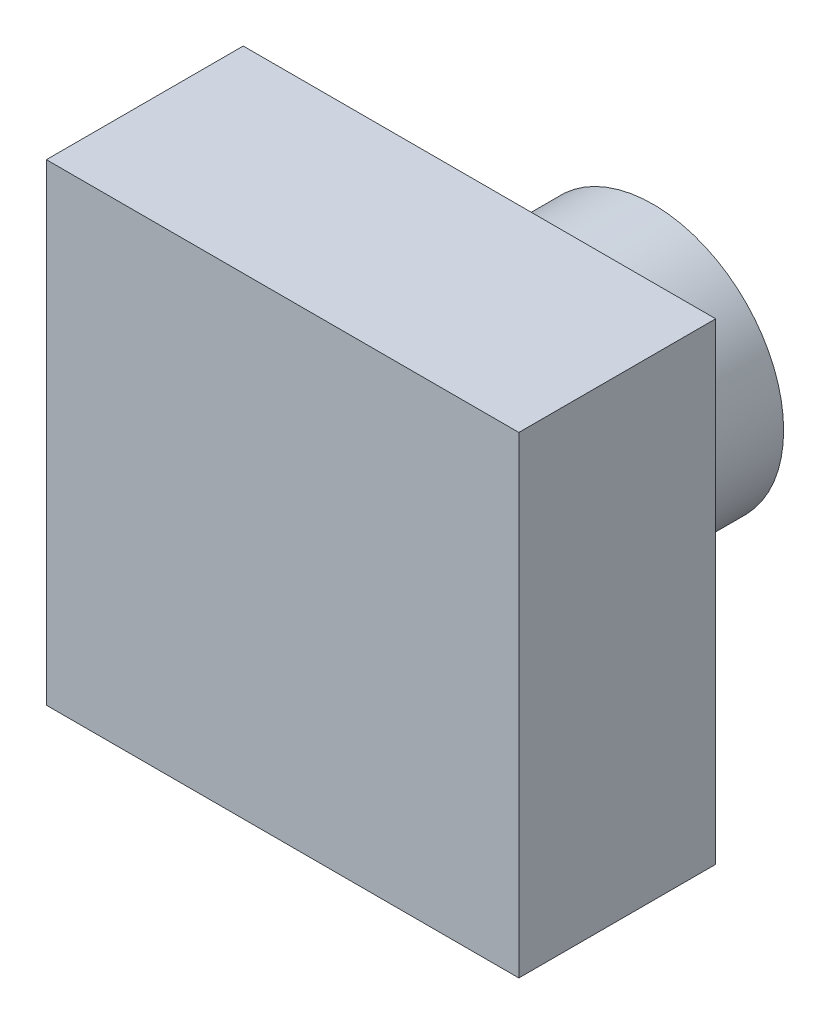
ISO-10303-21;
HEADER;
FILE_DESCRIPTION(('STEP AP214'),'2;1');
FILE_NAME('part.step','',(''),(''),'','','');
FILE_SCHEMA(('AUTOMOTIVE_DESIGN { 1 0 10303 214 1 1 1 1 }'));
ENDSEC;
DATA;
#1=APPLICATION_CONTEXT('core data for automotive mechanical design processes');
#2=APPLICATION_PROTOCOL_DEFINITION('international standard','automotive_design',2000,#1);
#3=PRODUCT_CONTEXT('',#1,'mechanical');
#4=PRODUCT('Part','Part','',(#3));
#5=PRODUCT_RELATED_PRODUCT_CATEGORY('part','',(#4));
#6=PRODUCT_DEFINITION_FORMATION('','',#4);
#7=PRODUCT_DEFINITION_CONTEXT('part definition',#1,'design');
#8=PRODUCT_DEFINITION('design','',#6,#7);
#9=PRODUCT_DEFINITION_SHAPE('','',#8);
#10=(LENGTH_UNIT() NAMED_UNIT(*) SI_UNIT(.MILLI.,.METRE.));
#11=(NAMED_UNIT(*) PLANE_ANGLE_UNIT() SI_UNIT($,.RADIAN.));
#12=(NAMED_UNIT(*) SI_UNIT($,.STERADIAN.) SOLID_ANGLE_UNIT());
#13=UNCERTAINTY_MEASURE_WITH_UNIT(LENGTH_MEASURE(1.E-05),#10,'distance_accuracy_value','');
#14=(GEOMETRIC_REPRESENTATION_CONTEXT(3) GLOBAL_UNCERTAINTY_ASSIGNED_CONTEXT((#13)) GLOBAL_UNIT_ASSIGNED_CONTEXT((#10,
#11,#12)) REPRESENTATION_CONTEXT('',''));
#15=CARTESIAN_POINT('',(0.,0.,0.));
#16=DIRECTION('',(0.,0.,1.));
#17=DIRECTION('',(1.,0.,0.));
#18=AXIS2_PLACEMENT_3D('',#15,#16,#17);
#19=CARTESIAN_POINT('',(0.,0.,4.41));
#20=DIRECTION('',(0.,0.,-1.));
#21=DIRECTION('',(-1.,0.,0.));
#22=AXIS2_PLACEMENT_3D('',#19,#20,#21);
#23=CYLINDRICAL_SURFACE('',#22,3.315);
#24=CARTESIAN_POINT('',(0.,0.,4.41));
#25=DIRECTION('',(0.,0.,1.));
#26=DIRECTION('',(1.,0.,0.));
#27=AXIS2_PLACEMENT_3D('',#24,#25,#26);
#28=CIRCLE('',#27,3.315);
#29=CARTESIAN_POINT('',(3.315,0.,4.41));
#30=VERTEX_POINT('',#29);
#31=EDGE_CURVE('E11',#30,#30,#28,.T.);
#32=ORIENTED_EDGE('',*,*,#31,.F.);
#33=EDGE_LOOP('',(#32));
#34=FACE_BOUND('',#33,.T.);
#35=CARTESIAN_POINT('',(0.,0.,0.));
#36=DIRECTION('',(0.,0.,1.));
#37=DIRECTION('',(1.,0.,0.));
#38=AXIS2_PLACEMENT_3D('',#35,#36,#37);
#39=CIRCLE('',#38,3.315);
#40=CARTESIAN_POINT('',(3.315,0.,0.));
#41=VERTEX_POINT('',#40);
#42=EDGE_CURVE('E37',#41,#41,#39,.T.);
#43=ORIENTED_EDGE('',*,*,#42,.T.);
#44=EDGE_LOOP('',(#43));
#45=FACE_BOUND('',#44,.T.);
#46=ADVANCED_FACE('F34',(#34,#45),#23,.T.);
#47=CARTESIAN_POINT('',(0.,0.,0.));
#48=DIRECTION('',(0.,0.,1.));
#49=DIRECTION('',(1.,0.,0.));
#50=AXIS2_PLACEMENT_3D('',#47,#48,#49);
#51=PLANE('',#50);
#52=ORIENTED_EDGE('',*,*,#42,.F.);
#53=EDGE_LOOP('',(#52));
#54=FACE_BOUND('',#53,.T.);
#55=ADVANCED_FACE('F113',(#54),#51,.F.);
#56=CARTESIAN_POINT('',(-6.,6.,9.41));
#57=DIRECTION('',(1.,0.,0.));
#58=DIRECTION('',(0.,1.,0.));
#59=AXIS2_PLACEMENT_3D('',#56,#57,#58);
#60=PLANE('',#59);
#61=DIRECTION('',(0.,-1.,0.));
#62=VECTOR('',#61,1.);
#63=CARTESIAN_POINT('',(-6.,6.,4.41));
#64=LINE('',#63,#62);
#65=CARTESIAN_POINT('',(-6.,6.,4.41));
#66=VERTEX_POINT('',#65);
#67=CARTESIAN_POINT('',(-6.,-6.,4.41));
#68=VERTEX_POINT('',#67);
#69=EDGE_CURVE('E101',#66,#68,#64,.T.);
#70=ORIENTED_EDGE('',*,*,#69,.T.);
#71=DIRECTION('',(0.,0.,-1.));
#72=VECTOR('',#71,1.);
#73=CARTESIAN_POINT('',(-6.,-6.,9.41));
#74=LINE('',#73,#72);
#75=CARTESIAN_POINT('',(-6.,-6.,9.41));
#76=VERTEX_POINT('',#75);
#77=EDGE_CURVE('E92',#76,#68,#74,.T.);
#78=ORIENTED_EDGE('',*,*,#77,.F.);
#79=DIRECTION('',(0.,-1.,0.));
#80=VECTOR('',#79,1.);
#81=CARTESIAN_POINT('',(-6.,6.,9.41));
#82=LINE('',#81,#80);
#83=CARTESIAN_POINT('',(-6.,6.,9.41));
#84=VERTEX_POINT('',#83);
#85=EDGE_CURVE('E86',#84,#76,#82,.T.);
#86=ORIENTED_EDGE('',*,*,#85,.F.);
#87=DIRECTION('',(0.,0.,-1.));
#88=VECTOR('',#87,1.);
#89=CARTESIAN_POINT('',(-6.,6.,9.41));
#90=LINE('',#89,#88);
#91=EDGE_CURVE('E97',#84,#66,#90,.T.);
#92=ORIENTED_EDGE('',*,*,#91,.T.);
#93=EDGE_LOOP('',(#70,#78,#86,#92));
#94=FACE_BOUND('',#93,.T.);
#95=ADVANCED_FACE('F115',(#94),#60,.F.);
#96=CARTESIAN_POINT('',(-6.,-6.,9.41));
#97=DIRECTION('',(0.,1.,0.));
#98=DIRECTION('',(0.,0.,1.));
#99=AXIS2_PLACEMENT_3D('',#96,#97,#98);
#100=PLANE('',#99);
#101=DIRECTION('',(1.,0.,0.));
#102=VECTOR('',#101,1.);
#103=CARTESIAN_POINT('',(-6.,-6.,4.41));
#104=LINE('',#103,#102);
#105=CARTESIAN_POINT('',(6.,-6.,4.41));
#106=VERTEX_POINT('',#105);
#107=EDGE_CURVE('E91',#68,#106,#104,.T.);
#108=ORIENTED_EDGE('',*,*,#107,.T.);
#109=DIRECTION('',(0.,0.,-1.));
#110=VECTOR('',#109,1.);
#111=CARTESIAN_POINT('',(6.,-6.,9.41));
#112=LINE('',#111,#110);
#113=CARTESIAN_POINT('',(6.,-6.,9.41));
#114=VERTEX_POINT('',#113);
#115=EDGE_CURVE('E89',#114,#106,#112,.T.);
#116=ORIENTED_EDGE('',*,*,#115,.F.);
#117=DIRECTION('',(1.,0.,0.));
#118=VECTOR('',#117,1.);
#119=CARTESIAN_POINT('',(-6.,-6.,9.41));
#120=LINE('',#119,#118);
#121=EDGE_CURVE('E81',#76,#114,#120,.T.);
#122=ORIENTED_EDGE('',*,*,#121,.F.);
#123=ORIENTED_EDGE('',*,*,#77,.T.);
#124=EDGE_LOOP('',(#108,#116,#122,#123));
#125=FACE_BOUND('',#124,.T.);
#126=ADVANCED_FACE('F90',(#125),#100,.F.);
#127=CARTESIAN_POINT('',(6.,6.,9.41));
#128=DIRECTION('',(-1.,0.,0.));
#129=DIRECTION('',(0.,-1.,0.));
#130=AXIS2_PLACEMENT_3D('',#127,#128,#129);
#131=PLANE('',#130);
#132=DIRECTION('',(0.,1.,0.));
#133=VECTOR('',#132,1.);
#134=CARTESIAN_POINT('',(6.,6.,4.41));
#135=LINE('',#134,#133);
#136=CARTESIAN_POINT('',(6.,6.,4.41));
#137=VERTEX_POINT('',#136);
#138=EDGE_CURVE('E67',#106,#137,#135,.T.);
#139=ORIENTED_EDGE('',*,*,#138,.T.);
#140=DIRECTION('',(0.,0.,-1.));
#141=VECTOR('',#140,1.);
#142=CARTESIAN_POINT('',(6.,6.,9.41));
#143=LINE('',#142,#141);
#144=CARTESIAN_POINT('',(6.,6.,9.41));
#145=VERTEX_POINT('',#144);
#146=EDGE_CURVE('E93',#145,#137,#143,.T.);
#147=ORIENTED_EDGE('',*,*,#146,.F.);
#148=DIRECTION('',(0.,1.,0.));
#149=VECTOR('',#148,1.);
#150=CARTESIAN_POINT('',(6.,6.,9.41));
#151=LINE('',#150,#149);
#152=EDGE_CURVE('E84',#114,#145,#151,.T.);
#153=ORIENTED_EDGE('',*,*,#152,.F.);
#154=ORIENTED_EDGE('',*,*,#115,.T.);
#155=EDGE_LOOP('',(#139,#147,#153,#154));
#156=FACE_BOUND('',#155,.T.);
#157=ADVANCED_FACE('F95',(#156),#131,.F.);
#158=CARTESIAN_POINT('',(-6.,6.,9.41));
#159=DIRECTION('',(0.,-1.,0.));
#160=DIRECTION('',(1.,0.,0.));
#161=AXIS2_PLACEMENT_3D('',#158,#159,#160);
#162=PLANE('',#161);
#163=DIRECTION('',(-1.,0.,0.));
#164=VECTOR('',#163,1.);
#165=CARTESIAN_POINT('',(-6.,6.,4.41));
#166=LINE('',#165,#164);
#167=EDGE_CURVE('E73',#137,#66,#166,.T.);
#168=ORIENTED_EDGE('',*,*,#167,.T.);
#169=ORIENTED_EDGE('',*,*,#91,.F.);
#170=DIRECTION('',(-1.,0.,0.));
#171=VECTOR('',#170,1.);
#172=CARTESIAN_POINT('',(-6.,6.,9.41));
#173=LINE('',#172,#171);
#174=EDGE_CURVE('E50',#145,#84,#173,.T.);
#175=ORIENTED_EDGE('',*,*,#174,.F.);
#176=ORIENTED_EDGE('',*,*,#146,.T.);
#177=EDGE_LOOP('',(#168,#169,#175,#176));
#178=FACE_BOUND('',#177,.T.);
#179=ADVANCED_FACE('F128',(#178),#162,.F.);
#180=CARTESIAN_POINT('',(0.,0.,9.41));
#181=DIRECTION('',(0.,0.,1.));
#182=DIRECTION('',(1.,0.,0.));
#183=AXIS2_PLACEMENT_3D('',#180,#181,#182);
#184=PLANE('',#183);
#185=ORIENTED_EDGE('',*,*,#85,.T.);
#186=ORIENTED_EDGE('',*,*,#121,.T.);
#187=ORIENTED_EDGE('',*,*,#152,.T.);
#188=ORIENTED_EDGE('',*,*,#174,.T.);
#189=EDGE_LOOP('',(#185,#186,#187,#188));
#190=FACE_BOUND('',#189,.T.);
#191=ADVANCED_FACE('F82',(#190),#184,.T.);
#192=CARTESIAN_POINT('',(0.,0.,4.41));
#193=DIRECTION('',(0.,0.,1.));
#194=DIRECTION('',(1.,0.,0.));
#195=AXIS2_PLACEMENT_3D('',#192,#193,#194);
#196=PLANE('',#195);
#197=ORIENTED_EDGE('',*,*,#31,.T.);
#198=EDGE_LOOP('',(#197));
#199=FACE_BOUND('',#198,.T.);
#200=ORIENTED_EDGE('',*,*,#69,.F.);
#201=ORIENTED_EDGE('',*,*,#167,.F.);
#202=ORIENTED_EDGE('',*,*,#138,.F.);
#203=ORIENTED_EDGE('',*,*,#107,.F.);
#204=EDGE_LOOP('',(#200,#201,#202,#203));
#205=FACE_BOUND('',#204,.T.);
#206=ADVANCED_FACE('F131',(#199,#205),#196,.F.);
#207=CLOSED_SHELL('',(#46,#55,#95,#126,#157,#179,#191,#206));
#208=MANIFOLD_SOLID_BREP('B2',#207);
#209=ADVANCED_BREP_SHAPE_REPRESENTATION('',(#18,#208),#14);
#210=SHAPE_DEFINITION_REPRESENTATION(#9,#209);
ENDSEC;
END-ISO-10303-21;
